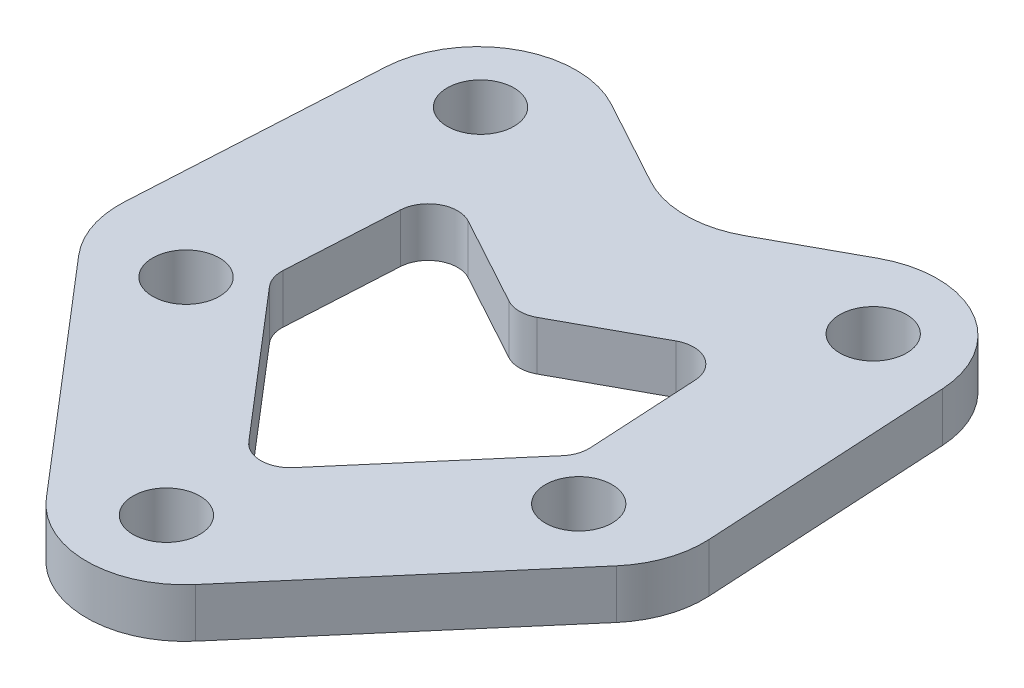
ISO-10303-21;
HEADER;
FILE_DESCRIPTION(('STEP AP214'),'2;1');
FILE_NAME('part.step','',(''),(''),'','','');
FILE_SCHEMA(('AUTOMOTIVE_DESIGN { 1 0 10303 214 1 1 1 1 }'));
ENDSEC;
DATA;
#1=APPLICATION_CONTEXT('core data for automotive mechanical design processes');
#2=APPLICATION_PROTOCOL_DEFINITION('international standard','automotive_design',2000,#1);
#3=PRODUCT_CONTEXT('',#1,'mechanical');
#4=PRODUCT('Part','Part','',(#3));
#5=PRODUCT_RELATED_PRODUCT_CATEGORY('part','',(#4));
#6=PRODUCT_DEFINITION_FORMATION('','',#4);
#7=PRODUCT_DEFINITION_CONTEXT('part definition',#1,'design');
#8=PRODUCT_DEFINITION('design','',#6,#7);
#9=PRODUCT_DEFINITION_SHAPE('','',#8);
#10=(LENGTH_UNIT() NAMED_UNIT(*) SI_UNIT(.MILLI.,.METRE.));
#11=(NAMED_UNIT(*) PLANE_ANGLE_UNIT() SI_UNIT($,.RADIAN.));
#12=(NAMED_UNIT(*) SI_UNIT($,.STERADIAN.) SOLID_ANGLE_UNIT());
#13=UNCERTAINTY_MEASURE_WITH_UNIT(LENGTH_MEASURE(1.E-05),#10,'distance_accuracy_value','');
#14=(GEOMETRIC_REPRESENTATION_CONTEXT(3) GLOBAL_UNCERTAINTY_ASSIGNED_CONTEXT((#13)) GLOBAL_UNIT_ASSIGNED_CONTEXT((#10,
#11,#12)) REPRESENTATION_CONTEXT('',''));
#15=CARTESIAN_POINT('',(0.,0.,0.));
#16=DIRECTION('',(0.,0.,1.));
#17=DIRECTION('',(1.,0.,0.));
#18=AXIS2_PLACEMENT_3D('',#15,#16,#17);
#19=CARTESIAN_POINT('',(-19.05,3.175,-3.175));
#20=DIRECTION('',(0.998460353205412,0.,0.055470019622523));
#21=DIRECTION('',(0.055470019622523,0.,-0.998460353205413));
#22=AXIS2_PLACEMENT_3D('',#19,#20,#21);
#23=PLANE('',#22);
#24=DIRECTION('',(-0.055470019622523,0.,0.998460353205412));
#25=VECTOR('',#24,1.);
#26=CARTESIAN_POINT('',(-19.05,0.,-3.175));
#27=LINE('',#26,#25);
#28=CARTESIAN_POINT('',(-18.0200099535956,0.,-21.7148208352801));
#29=VERTEX_POINT('',#28);
#30=CARTESIAN_POINT('',(-18.9084699795526,0.,-5.72254036805263));
#31=VERTEX_POINT('',#30);
#32=EDGE_CURVE('E244',#29,#31,#27,.T.);
#33=ORIENTED_EDGE('',*,*,#32,.T.);
#34=DIRECTION('',(0.,-1.,0.));
#35=VECTOR('',#34,1.);
#36=CARTESIAN_POINT('',(-18.9084699795526,3.175,-5.72254036805263));
#37=LINE('',#36,#35);
#38=CARTESIAN_POINT('',(-18.9084699795526,3.175,-5.72254036805263));
#39=VERTEX_POINT('',#38);
#40=EDGE_CURVE('E222',#31,#39,#37,.F.);
#41=ORIENTED_EDGE('',*,*,#40,.T.);
#42=DIRECTION('',(-0.055470019622523,0.,0.998460353205412));
#43=VECTOR('',#42,1.);
#44=CARTESIAN_POINT('',(-19.05,3.175,-3.175));
#45=LINE('',#44,#43);
#46=CARTESIAN_POINT('',(-18.0200099535956,3.175,-21.7148208352801));
#47=VERTEX_POINT('',#46);
#48=EDGE_CURVE('E263',#47,#39,#45,.T.);
#49=ORIENTED_EDGE('',*,*,#48,.F.);
#50=DIRECTION('',(0.,-1.,0.));
#51=VECTOR('',#50,1.);
#52=CARTESIAN_POINT('',(-18.0200099535956,3.175,-21.7148208352801));
#53=LINE('',#52,#51);
#54=EDGE_CURVE('E227',#47,#29,#53,.T.);
#55=ORIENTED_EDGE('',*,*,#54,.T.);
#56=EDGE_LOOP('',(#33,#41,#49,#55));
#57=FACE_BOUND('',#56,.T.);
#58=ADVANCED_FACE('F45',(#57),#23,.F.);
#59=CARTESIAN_POINT('',(0.,3.175,19.05));
#60=DIRECTION('',(0.759256602365296,0.,-0.650791373455968));
#61=DIRECTION('',(-0.650791373455969,0.,-0.759256602365297));
#62=AXIS2_PLACEMENT_3D('',#59,#60,#61);
#63=PLANE('',#62);
#64=DIRECTION('',(0.650791373455969,0.,0.759256602365297));
#65=VECTOR('',#64,1.);
#66=CARTESIAN_POINT('',(0.,3.175,19.05));
#67=LINE('',#66,#65);
#68=CARTESIAN_POINT('',(-17.3895261617179,3.175,-1.23778052200422));
#69=VERTEX_POINT('',#68);
#70=CARTESIAN_POINT('',(-4.82127942501963,3.175,13.4251740041438));
#71=VERTEX_POINT('',#70);
#72=EDGE_CURVE('E237',#69,#71,#67,.T.);
#73=ORIENTED_EDGE('',*,*,#72,.F.);
#74=DIRECTION('',(0.,-1.,0.));
#75=VECTOR('',#74,1.);
#76=CARTESIAN_POINT('',(-17.3895261617179,3.175,-1.23778052200422));
#77=LINE('',#76,#75);
#78=CARTESIAN_POINT('',(-17.3895261617179,0.,-1.23778052200422));
#79=VERTEX_POINT('',#78);
#80=EDGE_CURVE('E221',#69,#79,#77,.T.);
#81=ORIENTED_EDGE('',*,*,#80,.T.);
#82=DIRECTION('',(0.650791373455969,0.,0.759256602365297));
#83=VECTOR('',#82,1.);
#84=CARTESIAN_POINT('',(0.,0.,19.05));
#85=LINE('',#84,#83);
#86=CARTESIAN_POINT('',(-4.82127942501963,0.,13.4251740041438));
#87=VERTEX_POINT('',#86);
#88=EDGE_CURVE('E234',#79,#87,#85,.T.);
#89=ORIENTED_EDGE('',*,*,#88,.T.);
#90=DIRECTION('',(0.,-1.,0.));
#91=VECTOR('',#90,1.);
#92=CARTESIAN_POINT('',(-4.82127942501963,3.175,13.4251740041438));
#93=LINE('',#92,#91);
#94=EDGE_CURVE('E239',#87,#71,#93,.F.);
#95=ORIENTED_EDGE('',*,*,#94,.T.);
#96=EDGE_LOOP('',(#73,#81,#89,#95));
#97=FACE_BOUND('',#96,.T.);
#98=ADVANCED_FACE('F233',(#97),#63,.F.);
#99=CARTESIAN_POINT('',(19.05,3.175,-3.175));
#100=DIRECTION('',(-0.759256602365296,0.,-0.650791373455968));
#101=DIRECTION('',(-0.650791373455969,0.,0.759256602365297));
#102=AXIS2_PLACEMENT_3D('',#99,#100,#101);
#103=PLANE('',#102);
#104=DIRECTION('',(0.650791373455969,0.,-0.759256602365297));
#105=VECTOR('',#104,1.);
#106=CARTESIAN_POINT('',(19.05,3.175,-3.175));
#107=LINE('',#106,#105);
#108=CARTESIAN_POINT('',(4.82127942501963,3.175,13.4251740041438));
#109=VERTEX_POINT('',#108);
#110=CARTESIAN_POINT('',(17.3895261617179,3.175,-1.23778052200421));
#111=VERTEX_POINT('',#110);
#112=EDGE_CURVE('E455',#109,#111,#107,.T.);
#113=ORIENTED_EDGE('',*,*,#112,.F.);
#114=DIRECTION('',(0.,-1.,0.));
#115=VECTOR('',#114,1.);
#116=CARTESIAN_POINT('',(4.82127942501963,3.175,13.4251740041438));
#117=LINE('',#116,#115);
#118=CARTESIAN_POINT('',(4.82127942501963,0.,13.4251740041438));
#119=VERTEX_POINT('',#118);
#120=EDGE_CURVE('E290',#109,#119,#117,.T.);
#121=ORIENTED_EDGE('',*,*,#120,.T.);
#122=DIRECTION('',(0.650791373455969,0.,-0.759256602365297));
#123=VECTOR('',#122,1.);
#124=CARTESIAN_POINT('',(19.05,0.,-3.175));
#125=LINE('',#124,#123);
#126=CARTESIAN_POINT('',(17.3895261617179,0.,-1.23778052200421));
#127=VERTEX_POINT('',#126);
#128=EDGE_CURVE('E243',#119,#127,#125,.T.);
#129=ORIENTED_EDGE('',*,*,#128,.T.);
#130=DIRECTION('',(0.,-1.,0.));
#131=VECTOR('',#130,1.);
#132=CARTESIAN_POINT('',(17.3895261617179,3.175,-1.23778052200421));
#133=LINE('',#132,#131);
#134=EDGE_CURVE('E287',#127,#111,#133,.F.);
#135=ORIENTED_EDGE('',*,*,#134,.T.);
#136=EDGE_LOOP('',(#113,#121,#129,#135));
#137=FACE_BOUND('',#136,.T.);
#138=ADVANCED_FACE('F503',(#137),#103,.F.);
#139=CARTESIAN_POINT('',(17.4625,3.175,-31.75));
#140=DIRECTION('',(-0.998460353205412,0.,0.055470019622523));
#141=DIRECTION('',(0.055470019622523,0.,0.998460353205413));
#142=AXIS2_PLACEMENT_3D('',#139,#140,#141);
#143=PLANE('',#142);
#144=DIRECTION('',(-0.055470019622523,0.,-0.998460353205412));
#145=VECTOR('',#144,1.);
#146=CARTESIAN_POINT('',(17.4625,3.175,-31.75));
#147=LINE('',#146,#145);
#148=CARTESIAN_POINT('',(18.9084699795526,3.175,-5.72254036805263));
#149=VERTEX_POINT('',#148);
#150=CARTESIAN_POINT('',(18.0200099535956,3.175,-21.7148208352801));
#151=VERTEX_POINT('',#150);
#152=EDGE_CURVE('E459',#149,#151,#147,.T.);
#153=ORIENTED_EDGE('',*,*,#152,.F.);
#154=DIRECTION('',(0.,-1.,0.));
#155=VECTOR('',#154,1.);
#156=CARTESIAN_POINT('',(18.9084699795526,3.175,-5.72254036805264));
#157=LINE('',#156,#155);
#158=CARTESIAN_POINT('',(18.9084699795526,0.,-5.72254036805263));
#159=VERTEX_POINT('',#158);
#160=EDGE_CURVE('E295',#149,#159,#157,.T.);
#161=ORIENTED_EDGE('',*,*,#160,.T.);
#162=DIRECTION('',(-0.055470019622523,0.,-0.998460353205412));
#163=VECTOR('',#162,1.);
#164=CARTESIAN_POINT('',(17.4625,0.,-31.75));
#165=LINE('',#164,#163);
#166=CARTESIAN_POINT('',(18.0200099535956,0.,-21.7148208352801));
#167=VERTEX_POINT('',#166);
#168=EDGE_CURVE('E248',#159,#167,#165,.T.);
#169=ORIENTED_EDGE('',*,*,#168,.T.);
#170=DIRECTION('',(0.,-1.,0.));
#171=VECTOR('',#170,1.);
#172=CARTESIAN_POINT('',(18.0200099535956,3.175,-21.7148208352801));
#173=LINE('',#172,#171);
#174=EDGE_CURVE('E293',#167,#151,#173,.F.);
#175=ORIENTED_EDGE('',*,*,#174,.T.);
#176=EDGE_LOOP('',(#153,#161,#169,#175));
#177=FACE_BOUND('',#176,.T.);
#178=ADVANCED_FACE('F495',(#177),#143,.F.);
#179=CARTESIAN_POINT('',(0.,3.175,-22.225));
#180=DIRECTION('',(0.478852130680573,0.,0.877895572914384));
#181=DIRECTION('',(0.877895572914384,0.,-0.478852130680573));
#182=AXIS2_PLACEMENT_3D('',#179,#180,#181);
#183=PLANE('',#182);
#184=DIRECTION('',(-0.877895572914384,0.,0.478852130680573));
#185=VECTOR('',#184,1.);
#186=CARTESIAN_POINT('',(0.,3.175,-22.225));
#187=LINE('',#186,#185);
#188=CARTESIAN_POINT('',(8.63907568091955,3.175,-26.9372230986834));
#189=VERTEX_POINT('',#188);
#190=CARTESIAN_POINT('',(3.04071102982164,3.175,-23.88356965263));
#191=VERTEX_POINT('',#190);
#192=EDGE_CURVE('E463',#189,#191,#187,.T.);
#193=ORIENTED_EDGE('',*,*,#192,.F.);
#194=DIRECTION('',(0.,-1.,0.));
#195=VECTOR('',#194,1.);
#196=CARTESIAN_POINT('',(8.63907568091954,3.175,-26.9372230986834));
#197=LINE('',#196,#195);
#198=CARTESIAN_POINT('',(8.63907568091955,0.,-26.9372230986834));
#199=VERTEX_POINT('',#198);
#200=EDGE_CURVE('E301',#189,#199,#197,.T.);
#201=ORIENTED_EDGE('',*,*,#200,.T.);
#202=DIRECTION('',(-0.877895572914384,0.,0.478852130680573));
#203=VECTOR('',#202,1.);
#204=CARTESIAN_POINT('',(0.,0.,-22.225));
#205=LINE('',#204,#203);
#206=CARTESIAN_POINT('',(3.04071102982164,0.,-23.88356965263));
#207=VERTEX_POINT('',#206);
#208=EDGE_CURVE('E257',#199,#207,#205,.T.);
#209=ORIENTED_EDGE('',*,*,#208,.T.);
#210=DIRECTION('',(0.,-1.,0.));
#211=VECTOR('',#210,1.);
#212=CARTESIAN_POINT('',(3.04071102982164,3.175,-23.88356965263));
#213=LINE('',#212,#211);
#214=EDGE_CURVE('E299',#207,#191,#213,.F.);
#215=ORIENTED_EDGE('',*,*,#214,.T.);
#216=EDGE_LOOP('',(#193,#201,#209,#215));
#217=FACE_BOUND('',#216,.T.);
#218=ADVANCED_FACE('F486',(#217),#183,.F.);
#219=CARTESIAN_POINT('',(-17.4625,3.175,-31.75));
#220=DIRECTION('',(-0.478852130680573,0.,0.877895572914384));
#221=DIRECTION('',(0.877895572914384,0.,0.478852130680573));
#222=AXIS2_PLACEMENT_3D('',#219,#220,#221);
#223=PLANE('',#222);
#224=DIRECTION('',(-0.877895572914385,0.,-0.478852130680573));
#225=VECTOR('',#224,1.);
#226=CARTESIAN_POINT('',(-17.4625,0.,-31.75));
#227=LINE('',#226,#225);
#228=CARTESIAN_POINT('',(-3.04071102982163,0.,-23.88356965263));
#229=VERTEX_POINT('',#228);
#230=CARTESIAN_POINT('',(-8.63907568091954,0.,-26.9372230986834));
#231=VERTEX_POINT('',#230);
#232=EDGE_CURVE('E260',#229,#231,#227,.T.);
#233=ORIENTED_EDGE('',*,*,#232,.T.);
#234=DIRECTION('',(0.,-1.,0.));
#235=VECTOR('',#234,1.);
#236=CARTESIAN_POINT('',(-8.63907568091954,3.175,-26.9372230986834));
#237=LINE('',#236,#235);
#238=CARTESIAN_POINT('',(-8.63907568091954,3.175,-26.9372230986834));
#239=VERTEX_POINT('',#238);
#240=EDGE_CURVE('E307',#231,#239,#237,.F.);
#241=ORIENTED_EDGE('',*,*,#240,.T.);
#242=DIRECTION('',(-0.877895572914385,0.,-0.478852130680573));
#243=VECTOR('',#242,1.);
#244=CARTESIAN_POINT('',(-17.4625,3.175,-31.75));
#245=LINE('',#244,#243);
#246=CARTESIAN_POINT('',(-3.04071102982163,3.175,-23.88356965263));
#247=VERTEX_POINT('',#246);
#248=EDGE_CURVE('E264',#247,#239,#245,.T.);
#249=ORIENTED_EDGE('',*,*,#248,.F.);
#250=DIRECTION('',(0.,-1.,0.));
#251=VECTOR('',#250,1.);
#252=CARTESIAN_POINT('',(-3.04071102982164,0.,-23.88356965263));
#253=LINE('',#252,#251);
#254=EDGE_CURVE('E304',#247,#229,#253,.T.);
#255=ORIENTED_EDGE('',*,*,#254,.T.);
#256=EDGE_LOOP('',(#233,#241,#249,#255));
#257=FACE_BOUND('',#256,.T.);
#258=ADVANCED_FACE('F479',(#257),#223,.F.);
#259=CARTESIAN_POINT('',(0.,3.175,0.));
#260=DIRECTION('',(0.,-1.,0.));
#261=DIRECTION('',(0.,0.,-1.));
#262=AXIS2_PLACEMENT_3D('',#259,#260,#261);
#263=PLANE('',#262);
#264=DIRECTION('',(-0.877895572914384,0.,-0.478852130680573));
#265=VECTOR('',#264,1.);
#266=CARTESIAN_POINT('',(0.,3.175,-12.0985108431091));
#267=LINE('',#266,#265);
#268=CARTESIAN_POINT('',(-0.912213308946494,3.175,-12.5960817388981));
#269=VERTEX_POINT('',#268);
#270=CARTESIAN_POINT('',(-6.71967409931352,3.175,-15.7637876245529));
#271=VERTEX_POINT('',#270);
#272=EDGE_CURVE('E409',#269,#271,#267,.T.);
#273=ORIENTED_EDGE('',*,*,#272,.F.);
#274=CARTESIAN_POINT('',(0.,3.175,-14.2684728053));
#275=DIRECTION('',(0.,-1.,0.));
#276=DIRECTION('',(0.,0.,-1.));
#277=AXIS2_PLACEMENT_3D('',#274,#275,#276);
#278=CIRCLE('',#277,1.905);
#279=CARTESIAN_POINT('',(0.91221330894649,3.175,-12.5960817388981));
#280=VERTEX_POINT('',#279);
#281=EDGE_CURVE('E328',#269,#280,#278,.F.);
#282=ORIENTED_EDGE('',*,*,#281,.T.);
#283=DIRECTION('',(-0.877895572914384,0.,0.478852130680573));
#284=VECTOR('',#283,1.);
#285=CARTESIAN_POINT('',(9.36670139503766,3.175,-17.2076206949479));
#286=LINE('',#285,#284);
#287=CARTESIAN_POINT('',(6.71967409931352,3.175,-15.7637876245529));
#288=VERTEX_POINT('',#287);
#289=EDGE_CURVE('E419',#288,#280,#286,.T.);
#290=ORIENTED_EDGE('',*,*,#289,.F.);
#291=CARTESIAN_POINT('',(7.63188740826001,3.175,-14.091396558151));
#292=DIRECTION('',(0.,-1.,0.));
#293=DIRECTION('',(0.,0.,-1.));
#294=AXIS2_PLACEMENT_3D('',#291,#292,#293);
#295=CIRCLE('',#294,1.905);
#296=CARTESIAN_POINT('',(9.53395438111633,3.175,-14.1970669455319));
#297=VERTEX_POINT('',#296);
#298=EDGE_CURVE('E357',#288,#297,#295,.T.);
#299=ORIENTED_EDGE('',*,*,#298,.T.);
#300=DIRECTION('',(-0.055470019622523,0.,-0.998460353205412));
#301=VECTOR('',#300,1.);
#302=CARTESIAN_POINT('',(9.97554543137757,3.175,-6.24842804082946));
#303=LINE('',#302,#301);
#304=CARTESIAN_POINT('',(9.93308642524336,3.175,-7.01269015124525));
#305=VERTEX_POINT('',#304);
#306=EDGE_CURVE('E416',#305,#297,#303,.T.);
#307=ORIENTED_EDGE('',*,*,#306,.F.);
#308=CARTESIAN_POINT('',(8.03101945238705,3.175,-6.90701976386434));
#309=DIRECTION('',(0.,-1.,0.));
#310=DIRECTION('',(0.,0.,-1.));
#311=AXIS2_PLACEMENT_3D('',#308,#309,#310);
#312=CIRCLE('',#311,1.905);
#313=CARTESIAN_POINT('',(9.47740327989294,3.175,-5.66726219743072));
#314=VERTEX_POINT('',#313);
#315=EDGE_CURVE('E363',#305,#314,#312,.T.);
#316=ORIENTED_EDGE('',*,*,#315,.T.);
#317=DIRECTION('',(0.650791373455968,0.,-0.759256602365297));
#318=VECTOR('',#317,1.);
#319=CARTESIAN_POINT('',(0.,3.175,5.38970829577771));
#320=LINE('',#319,#318);
#321=CARTESIAN_POINT('',(1.44638382750589,3.175,3.70226049702084));
#322=VERTEX_POINT('',#321);
#323=EDGE_CURVE('E376',#322,#314,#320,.T.);
#324=ORIENTED_EDGE('',*,*,#323,.F.);
#325=CARTESIAN_POINT('',(0.,3.175,2.46250293058722));
#326=DIRECTION('',(0.,-1.,0.));
#327=DIRECTION('',(0.,0.,-1.));
#328=AXIS2_PLACEMENT_3D('',#325,#326,#327);
#329=CIRCLE('',#328,1.905);
#330=CARTESIAN_POINT('',(-1.44638382750589,3.175,3.70226049702084));
#331=VERTEX_POINT('',#330);
#332=EDGE_CURVE('E53',#322,#331,#329,.T.);
#333=ORIENTED_EDGE('',*,*,#332,.T.);
#334=DIRECTION('',(0.650791373455968,0.,0.759256602365297));
#335=VECTOR('',#334,1.);
#336=CARTESIAN_POINT('',(-9.97554543137757,3.175,-6.24842804082946));
#337=LINE('',#336,#335);
#338=CARTESIAN_POINT('',(-9.47740327989294,3.175,-5.66726219743072));
#339=VERTEX_POINT('',#338);
#340=EDGE_CURVE('E374',#339,#331,#337,.T.);
#341=ORIENTED_EDGE('',*,*,#340,.F.);
#342=CARTESIAN_POINT('',(-8.03101945238705,3.175,-6.90701976386434));
#343=DIRECTION('',(0.,-1.,0.));
#344=DIRECTION('',(0.,0.,-1.));
#345=AXIS2_PLACEMENT_3D('',#342,#343,#344);
#346=CIRCLE('',#345,1.905);
#347=CARTESIAN_POINT('',(-9.93308642524336,3.175,-7.01269015124524));
#348=VERTEX_POINT('',#347);
#349=EDGE_CURVE('E349',#339,#348,#346,.T.);
#350=ORIENTED_EDGE('',*,*,#349,.T.);
#351=DIRECTION('',(-0.055470019622523,0.,0.998460353205412));
#352=VECTOR('',#351,1.);
#353=CARTESIAN_POINT('',(-9.36670139503766,3.175,-17.2076206949479));
#354=LINE('',#353,#352);
#355=CARTESIAN_POINT('',(-9.53395438111632,3.175,-14.1970669455319));
#356=VERTEX_POINT('',#355);
#357=EDGE_CURVE('E385',#356,#348,#354,.T.);
#358=ORIENTED_EDGE('',*,*,#357,.F.);
#359=CARTESIAN_POINT('',(-7.63188740826001,3.175,-14.091396558151));
#360=DIRECTION('',(0.,-1.,0.));
#361=DIRECTION('',(0.,0.,-1.));
#362=AXIS2_PLACEMENT_3D('',#359,#360,#361);
#363=CIRCLE('',#362,1.905);
#364=EDGE_CURVE('E353',#356,#271,#363,.T.);
#365=ORIENTED_EDGE('',*,*,#364,.T.);
#366=EDGE_LOOP('',(#273,#282,#290,#299,#307,#316,#324,#333,#341,#350,#358,#365));
#367=FACE_BOUND('',#366,.T.);
#368=CARTESIAN_POINT('',(0.,3.175,10.4775));
#369=DIRECTION('',(0.,1.,0.));
#370=DIRECTION('',(0.,0.,1.));
#371=AXIS2_PLACEMENT_3D('',#368,#369,#370);
#372=CIRCLE('',#371,2.159);
#373=CARTESIAN_POINT('',(0.,3.175,12.6365));
#374=VERTEX_POINT('',#373);
#375=EDGE_CURVE('E425',#374,#374,#372,.T.);
#376=ORIENTED_EDGE('',*,*,#375,.F.);
#377=EDGE_LOOP('',(#376));
#378=FACE_BOUND('',#377,.T.);
#379=CARTESIAN_POINT('',(12.7,3.175,-3.4925));
#380=DIRECTION('',(0.,1.,0.));
#381=DIRECTION('',(0.,0.,1.));
#382=AXIS2_PLACEMENT_3D('',#379,#380,#381);
#383=CIRCLE('',#382,2.159);
#384=CARTESIAN_POINT('',(12.7,3.175,-1.3335));
#385=VERTEX_POINT('',#384);
#386=EDGE_CURVE('E428',#385,#385,#383,.T.);
#387=ORIENTED_EDGE('',*,*,#386,.F.);
#388=EDGE_LOOP('',(#387));
#389=FACE_BOUND('',#388,.T.);
#390=CARTESIAN_POINT('',(-12.7,3.175,-3.4925));
#391=DIRECTION('',(0.,1.,0.));
#392=DIRECTION('',(0.,0.,1.));
#393=AXIS2_PLACEMENT_3D('',#390,#391,#392);
#394=CIRCLE('',#393,2.159);
#395=CARTESIAN_POINT('',(-12.7,3.175,-1.3335));
#396=VERTEX_POINT('',#395);
#397=EDGE_CURVE('E435',#396,#396,#394,.T.);
#398=ORIENTED_EDGE('',*,*,#397,.F.);
#399=EDGE_LOOP('',(#398));
#400=FACE_BOUND('',#399,.T.);
#401=CARTESIAN_POINT('',(-12.7,3.175,-22.5425));
#402=DIRECTION('',(0.,1.,0.));
#403=DIRECTION('',(0.,0.,1.));
#404=AXIS2_PLACEMENT_3D('',#401,#402,#403);
#405=CIRCLE('',#404,2.159);
#406=CARTESIAN_POINT('',(-12.7,3.175,-20.3835));
#407=VERTEX_POINT('',#406);
#408=EDGE_CURVE('E441',#407,#407,#405,.T.);
#409=ORIENTED_EDGE('',*,*,#408,.F.);
#410=EDGE_LOOP('',(#409));
#411=FACE_BOUND('',#410,.T.);
#412=CARTESIAN_POINT('',(12.7,3.175,-22.5425));
#413=DIRECTION('',(0.,1.,0.));
#414=DIRECTION('',(0.,0.,1.));
#415=AXIS2_PLACEMENT_3D('',#412,#413,#414);
#416=CIRCLE('',#415,2.159);
#417=CARTESIAN_POINT('',(12.7,3.175,-20.3835));
#418=VERTEX_POINT('',#417);
#419=EDGE_CURVE('E447',#418,#418,#416,.T.);
#420=ORIENTED_EDGE('',*,*,#419,.F.);
#421=EDGE_LOOP('',(#420));
#422=FACE_BOUND('',#421,.T.);
#423=ORIENTED_EDGE('',*,*,#48,.T.);
#424=CARTESIAN_POINT('',(-12.5682467366983,3.175,-5.37030574344961));
#425=DIRECTION('',(0.,-1.,0.));
#426=DIRECTION('',(0.,0.,-1.));
#427=AXIS2_PLACEMENT_3D('',#424,#425,#426);
#428=CIRCLE('',#427,6.35);
#429=EDGE_CURVE('E285',#39,#69,#428,.F.);
#430=ORIENTED_EDGE('',*,*,#429,.T.);
#431=ORIENTED_EDGE('',*,*,#72,.T.);
#432=CARTESIAN_POINT('',(0.,3.175,9.29264878269836));
#433=DIRECTION('',(0.,-1.,0.));
#434=DIRECTION('',(0.,0.,-1.));
#435=AXIS2_PLACEMENT_3D('',#432,#433,#434);
#436=CIRCLE('',#435,6.35);
#437=EDGE_CURVE('E283',#71,#109,#436,.F.);
#438=ORIENTED_EDGE('',*,*,#437,.T.);
#439=ORIENTED_EDGE('',*,*,#112,.T.);
#440=CARTESIAN_POINT('',(12.5682467366983,3.175,-5.37030574344962));
#441=DIRECTION('',(0.,-1.,0.));
#442=DIRECTION('',(0.,0.,-1.));
#443=AXIS2_PLACEMENT_3D('',#440,#441,#442);
#444=CIRCLE('',#443,6.35);
#445=EDGE_CURVE('E280',#111,#149,#444,.F.);
#446=ORIENTED_EDGE('',*,*,#445,.T.);
#447=ORIENTED_EDGE('',*,*,#152,.T.);
#448=CARTESIAN_POINT('',(11.6797867107412,3.175,-21.362586210677));
#449=DIRECTION('',(0.,-1.,0.));
#450=DIRECTION('',(0.,0.,-1.));
#451=AXIS2_PLACEMENT_3D('',#448,#449,#450);
#452=CIRCLE('',#451,6.35);
#453=EDGE_CURVE('E278',#151,#189,#452,.F.);
#454=ORIENTED_EDGE('',*,*,#453,.T.);
#455=ORIENTED_EDGE('',*,*,#192,.T.);
#456=CARTESIAN_POINT('',(0.,3.175,-29.4582065406363));
#457=DIRECTION('',(0.,-1.,0.));
#458=DIRECTION('',(0.,0.,-1.));
#459=AXIS2_PLACEMENT_3D('',#456,#457,#458);
#460=CIRCLE('',#459,6.35);
#461=EDGE_CURVE('E311',#191,#247,#460,.T.);
#462=ORIENTED_EDGE('',*,*,#461,.T.);
#463=ORIENTED_EDGE('',*,*,#248,.T.);
#464=CARTESIAN_POINT('',(-11.6797867107412,3.175,-21.362586210677));
#465=DIRECTION('',(0.,-1.,0.));
#466=DIRECTION('',(0.,0.,-1.));
#467=AXIS2_PLACEMENT_3D('',#464,#465,#466);
#468=CIRCLE('',#467,6.35);
#469=EDGE_CURVE('E276',#239,#47,#468,.F.);
#470=ORIENTED_EDGE('',*,*,#469,.T.);
#471=EDGE_LOOP('',(#423,#430,#431,#438,#439,#446,#447,#454,#455,#462,#463,#470));
#472=FACE_BOUND('',#471,.T.);
#473=ADVANCED_FACE('F372',(#367,#378,#389,#400,#411,#422,#472),#263,.F.);
#474=CARTESIAN_POINT('',(0.,0.,0.));
#475=DIRECTION('',(0.,-1.,0.));
#476=DIRECTION('',(0.,0.,-1.));
#477=AXIS2_PLACEMENT_3D('',#474,#475,#476);
#478=PLANE('',#477);
#479=DIRECTION('',(-0.877895572914384,0.,0.478852130680573));
#480=VECTOR('',#479,1.);
#481=CARTESIAN_POINT('',(9.36670139503766,0.,-17.2076206949479));
#482=LINE('',#481,#480);
#483=CARTESIAN_POINT('',(6.71967409931352,0.,-15.7637876245529));
#484=VERTEX_POINT('',#483);
#485=CARTESIAN_POINT('',(0.91221330894649,0.,-12.5960817388981));
#486=VERTEX_POINT('',#485);
#487=EDGE_CURVE('E401',#484,#486,#482,.T.);
#488=ORIENTED_EDGE('',*,*,#487,.T.);
#489=CARTESIAN_POINT('',(0.,0.,-14.2684728053));
#490=DIRECTION('',(0.,-1.,0.));
#491=DIRECTION('',(0.,0.,-1.));
#492=AXIS2_PLACEMENT_3D('',#489,#490,#491);
#493=CIRCLE('',#492,1.905);
#494=CARTESIAN_POINT('',(-0.912213308946494,0.,-12.5960817388981));
#495=VERTEX_POINT('',#494);
#496=EDGE_CURVE('E335',#486,#495,#493,.T.);
#497=ORIENTED_EDGE('',*,*,#496,.T.);
#498=DIRECTION('',(-0.877895572914384,0.,-0.478852130680573));
#499=VECTOR('',#498,1.);
#500=CARTESIAN_POINT('',(0.,0.,-12.0985108431091));
#501=LINE('',#500,#499);
#502=CARTESIAN_POINT('',(-6.71967409931352,0.,-15.7637876245529));
#503=VERTEX_POINT('',#502);
#504=EDGE_CURVE('E422',#495,#503,#501,.T.);
#505=ORIENTED_EDGE('',*,*,#504,.T.);
#506=CARTESIAN_POINT('',(-7.63188740826001,0.,-14.091396558151));
#507=DIRECTION('',(0.,-1.,0.));
#508=DIRECTION('',(0.,0.,-1.));
#509=AXIS2_PLACEMENT_3D('',#506,#507,#508);
#510=CIRCLE('',#509,1.905);
#511=CARTESIAN_POINT('',(-9.53395438111632,0.,-14.1970669455319));
#512=VERTEX_POINT('',#511);
#513=EDGE_CURVE('E355',#503,#512,#510,.F.);
#514=ORIENTED_EDGE('',*,*,#513,.T.);
#515=DIRECTION('',(-0.055470019622523,0.,0.998460353205412));
#516=VECTOR('',#515,1.);
#517=CARTESIAN_POINT('',(-9.36670139503766,0.,-17.2076206949479));
#518=LINE('',#517,#516);
#519=CARTESIAN_POINT('',(-9.93308642524336,0.,-7.01269015124524));
#520=VERTEX_POINT('',#519);
#521=EDGE_CURVE('E403',#512,#520,#518,.T.);
#522=ORIENTED_EDGE('',*,*,#521,.T.);
#523=CARTESIAN_POINT('',(-8.03101945238705,0.,-6.90701976386434));
#524=DIRECTION('',(0.,-1.,0.));
#525=DIRECTION('',(0.,0.,-1.));
#526=AXIS2_PLACEMENT_3D('',#523,#524,#525);
#527=CIRCLE('',#526,1.905);
#528=CARTESIAN_POINT('',(-9.47740327989294,0.,-5.66726219743072));
#529=VERTEX_POINT('',#528);
#530=EDGE_CURVE('E351',#520,#529,#527,.F.);
#531=ORIENTED_EDGE('',*,*,#530,.T.);
#532=DIRECTION('',(0.650791373455968,0.,0.759256602365297));
#533=VECTOR('',#532,1.);
#534=CARTESIAN_POINT('',(-9.97554543137757,0.,-6.24842804082946));
#535=LINE('',#534,#533);
#536=CARTESIAN_POINT('',(-1.44638382750589,0.,3.70226049702084));
#537=VERTEX_POINT('',#536);
#538=EDGE_CURVE('E392',#529,#537,#535,.T.);
#539=ORIENTED_EDGE('',*,*,#538,.T.);
#540=CARTESIAN_POINT('',(0.,0.,2.46250293058722));
#541=DIRECTION('',(0.,-1.,0.));
#542=DIRECTION('',(0.,0.,-1.));
#543=AXIS2_PLACEMENT_3D('',#540,#541,#542);
#544=CIRCLE('',#543,1.905);
#545=CARTESIAN_POINT('',(1.44638382750589,0.,3.70226049702084));
#546=VERTEX_POINT('',#545);
#547=EDGE_CURVE('E11',#537,#546,#544,.F.);
#548=ORIENTED_EDGE('',*,*,#547,.T.);
#549=DIRECTION('',(0.650791373455968,0.,-0.759256602365297));
#550=VECTOR('',#549,1.);
#551=CARTESIAN_POINT('',(0.,0.,5.38970829577771));
#552=LINE('',#551,#550);
#553=CARTESIAN_POINT('',(9.47740327989294,0.,-5.66726219743072));
#554=VERTEX_POINT('',#553);
#555=EDGE_CURVE('E391',#546,#554,#552,.T.);
#556=ORIENTED_EDGE('',*,*,#555,.T.);
#557=CARTESIAN_POINT('',(8.03101945238705,0.,-6.90701976386434));
#558=DIRECTION('',(0.,-1.,0.));
#559=DIRECTION('',(0.,0.,-1.));
#560=AXIS2_PLACEMENT_3D('',#557,#558,#559);
#561=CIRCLE('',#560,1.905);
#562=CARTESIAN_POINT('',(9.93308642524336,0.,-7.01269015124525));
#563=VERTEX_POINT('',#562);
#564=EDGE_CURVE('E72',#554,#563,#561,.F.);
#565=ORIENTED_EDGE('',*,*,#564,.T.);
#566=DIRECTION('',(-0.055470019622523,0.,-0.998460353205412));
#567=VECTOR('',#566,1.);
#568=CARTESIAN_POINT('',(9.97554543137757,0.,-6.24842804082946));
#569=LINE('',#568,#567);
#570=CARTESIAN_POINT('',(9.53395438111633,0.,-14.1970669455319));
#571=VERTEX_POINT('',#570);
#572=EDGE_CURVE('E397',#563,#571,#569,.T.);
#573=ORIENTED_EDGE('',*,*,#572,.T.);
#574=CARTESIAN_POINT('',(7.63188740826001,0.,-14.091396558151));
#575=DIRECTION('',(0.,-1.,0.));
#576=DIRECTION('',(0.,0.,-1.));
#577=AXIS2_PLACEMENT_3D('',#574,#575,#576);
#578=CIRCLE('',#577,1.905);
#579=EDGE_CURVE('E360',#571,#484,#578,.F.);
#580=ORIENTED_EDGE('',*,*,#579,.T.);
#581=EDGE_LOOP('',(#488,#497,#505,#514,#522,#531,#539,#548,#556,#565,#573,#580));
#582=FACE_BOUND('',#581,.T.);
#583=CARTESIAN_POINT('',(0.,0.,10.4775));
#584=DIRECTION('',(0.,1.,0.));
#585=DIRECTION('',(0.,0.,1.));
#586=AXIS2_PLACEMENT_3D('',#583,#584,#585);
#587=CIRCLE('',#586,2.159);
#588=CARTESIAN_POINT('',(0.,0.,12.6365));
#589=VERTEX_POINT('',#588);
#590=EDGE_CURVE('E250',#589,#589,#587,.T.);
#591=ORIENTED_EDGE('',*,*,#590,.T.);
#592=EDGE_LOOP('',(#591));
#593=FACE_BOUND('',#592,.T.);
#594=CARTESIAN_POINT('',(12.7,0.,-3.4925));
#595=DIRECTION('',(0.,1.,0.));
#596=DIRECTION('',(0.,0.,1.));
#597=AXIS2_PLACEMENT_3D('',#594,#595,#596);
#598=CIRCLE('',#597,2.159);
#599=CARTESIAN_POINT('',(12.7,0.,-1.3335));
#600=VERTEX_POINT('',#599);
#601=EDGE_CURVE('E432',#600,#600,#598,.T.);
#602=ORIENTED_EDGE('',*,*,#601,.T.);
#603=EDGE_LOOP('',(#602));
#604=FACE_BOUND('',#603,.T.);
#605=CARTESIAN_POINT('',(-12.7,0.,-3.4925));
#606=DIRECTION('',(0.,1.,0.));
#607=DIRECTION('',(0.,0.,1.));
#608=AXIS2_PLACEMENT_3D('',#605,#606,#607);
#609=CIRCLE('',#608,2.159);
#610=CARTESIAN_POINT('',(-12.7,0.,-1.3335));
#611=VERTEX_POINT('',#610);
#612=EDGE_CURVE('E438',#611,#611,#609,.T.);
#613=ORIENTED_EDGE('',*,*,#612,.T.);
#614=EDGE_LOOP('',(#613));
#615=FACE_BOUND('',#614,.T.);
#616=CARTESIAN_POINT('',(-12.7,0.,-22.5425));
#617=DIRECTION('',(0.,1.,0.));
#618=DIRECTION('',(0.,0.,1.));
#619=AXIS2_PLACEMENT_3D('',#616,#617,#618);
#620=CIRCLE('',#619,2.159);
#621=CARTESIAN_POINT('',(-12.7,0.,-20.3835));
#622=VERTEX_POINT('',#621);
#623=EDGE_CURVE('E444',#622,#622,#620,.T.);
#624=ORIENTED_EDGE('',*,*,#623,.T.);
#625=EDGE_LOOP('',(#624));
#626=FACE_BOUND('',#625,.T.);
#627=CARTESIAN_POINT('',(12.7,0.,-22.5425));
#628=DIRECTION('',(0.,1.,0.));
#629=DIRECTION('',(0.,0.,1.));
#630=AXIS2_PLACEMENT_3D('',#627,#628,#629);
#631=CIRCLE('',#630,2.159);
#632=CARTESIAN_POINT('',(12.7,0.,-20.3835));
#633=VERTEX_POINT('',#632);
#634=EDGE_CURVE('E408',#633,#633,#631,.T.);
#635=ORIENTED_EDGE('',*,*,#634,.T.);
#636=EDGE_LOOP('',(#635));
#637=FACE_BOUND('',#636,.T.);
#638=ORIENTED_EDGE('',*,*,#88,.F.);
#639=CARTESIAN_POINT('',(-12.5682467366983,0.,-5.37030574344961));
#640=DIRECTION('',(0.,-1.,0.));
#641=DIRECTION('',(0.,0.,-1.));
#642=AXIS2_PLACEMENT_3D('',#639,#640,#641);
#643=CIRCLE('',#642,6.35);
#644=EDGE_CURVE('E217',#79,#31,#643,.T.);
#645=ORIENTED_EDGE('',*,*,#644,.T.);
#646=ORIENTED_EDGE('',*,*,#32,.F.);
#647=CARTESIAN_POINT('',(-11.6797867107412,0.,-21.362586210677));
#648=DIRECTION('',(0.,-1.,0.));
#649=DIRECTION('',(0.,0.,-1.));
#650=AXIS2_PLACEMENT_3D('',#647,#648,#649);
#651=CIRCLE('',#650,6.35);
#652=EDGE_CURVE('E238',#29,#231,#651,.T.);
#653=ORIENTED_EDGE('',*,*,#652,.T.);
#654=ORIENTED_EDGE('',*,*,#232,.F.);
#655=CARTESIAN_POINT('',(0.,0.,-29.4582065406363));
#656=DIRECTION('',(0.,-1.,0.));
#657=DIRECTION('',(0.,0.,-1.));
#658=AXIS2_PLACEMENT_3D('',#655,#656,#657);
#659=CIRCLE('',#658,6.35);
#660=EDGE_CURVE('E309',#229,#207,#659,.F.);
#661=ORIENTED_EDGE('',*,*,#660,.T.);
#662=ORIENTED_EDGE('',*,*,#208,.F.);
#663=CARTESIAN_POINT('',(11.6797867107412,0.,-21.362586210677));
#664=DIRECTION('',(0.,-1.,0.));
#665=DIRECTION('',(0.,0.,-1.));
#666=AXIS2_PLACEMENT_3D('',#663,#664,#665);
#667=CIRCLE('',#666,6.35);
#668=EDGE_CURVE('E267',#199,#167,#667,.T.);
#669=ORIENTED_EDGE('',*,*,#668,.T.);
#670=ORIENTED_EDGE('',*,*,#168,.F.);
#671=CARTESIAN_POINT('',(12.5682467366983,0.,-5.37030574344962));
#672=DIRECTION('',(0.,-1.,0.));
#673=DIRECTION('',(0.,0.,-1.));
#674=AXIS2_PLACEMENT_3D('',#671,#672,#673);
#675=CIRCLE('',#674,6.35);
#676=EDGE_CURVE('E269',#159,#127,#675,.T.);
#677=ORIENTED_EDGE('',*,*,#676,.T.);
#678=ORIENTED_EDGE('',*,*,#128,.F.);
#679=CARTESIAN_POINT('',(0.,0.,9.29264878269836));
#680=DIRECTION('',(0.,-1.,0.));
#681=DIRECTION('',(0.,0.,-1.));
#682=AXIS2_PLACEMENT_3D('',#679,#680,#681);
#683=CIRCLE('',#682,6.35);
#684=EDGE_CURVE('E228',#119,#87,#683,.T.);
#685=ORIENTED_EDGE('',*,*,#684,.T.);
#686=EDGE_LOOP('',(#638,#645,#646,#653,#654,#661,#662,#669,#670,#677,#678,#685));
#687=FACE_BOUND('',#686,.T.);
#688=ADVANCED_FACE('F241',(#582,#593,#604,#615,#626,#637,#687),#478,.T.);
#689=CARTESIAN_POINT('',(12.7,0.,-22.5425));
#690=DIRECTION('',(0.,1.,0.));
#691=DIRECTION('',(0.,0.,1.));
#692=AXIS2_PLACEMENT_3D('',#689,#690,#691);
#693=CYLINDRICAL_SURFACE('',#692,2.159);
#694=ORIENTED_EDGE('',*,*,#634,.F.);
#695=EDGE_LOOP('',(#694));
#696=FACE_BOUND('',#695,.T.);
#697=ORIENTED_EDGE('',*,*,#419,.T.);
#698=EDGE_LOOP('',(#697));
#699=FACE_BOUND('',#698,.T.);
#700=ADVANCED_FACE('F535',(#696,#699),#693,.F.);
#701=CARTESIAN_POINT('',(-12.7,0.,-22.5425));
#702=DIRECTION('',(0.,1.,0.));
#703=DIRECTION('',(0.,0.,1.));
#704=AXIS2_PLACEMENT_3D('',#701,#702,#703);
#705=CYLINDRICAL_SURFACE('',#704,2.159);
#706=ORIENTED_EDGE('',*,*,#623,.F.);
#707=EDGE_LOOP('',(#706));
#708=FACE_BOUND('',#707,.T.);
#709=ORIENTED_EDGE('',*,*,#408,.T.);
#710=EDGE_LOOP('',(#709));
#711=FACE_BOUND('',#710,.T.);
#712=ADVANCED_FACE('F540',(#708,#711),#705,.F.);
#713=CARTESIAN_POINT('',(-12.7,0.,-3.4925));
#714=DIRECTION('',(0.,1.,0.));
#715=DIRECTION('',(0.,0.,1.));
#716=AXIS2_PLACEMENT_3D('',#713,#714,#715);
#717=CYLINDRICAL_SURFACE('',#716,2.159);
#718=ORIENTED_EDGE('',*,*,#612,.F.);
#719=EDGE_LOOP('',(#718));
#720=FACE_BOUND('',#719,.T.);
#721=ORIENTED_EDGE('',*,*,#397,.T.);
#722=EDGE_LOOP('',(#721));
#723=FACE_BOUND('',#722,.T.);
#724=ADVANCED_FACE('F544',(#720,#723),#717,.F.);
#725=CARTESIAN_POINT('',(12.7,0.,-3.4925));
#726=DIRECTION('',(0.,1.,0.));
#727=DIRECTION('',(0.,0.,1.));
#728=AXIS2_PLACEMENT_3D('',#725,#726,#727);
#729=CYLINDRICAL_SURFACE('',#728,2.159);
#730=ORIENTED_EDGE('',*,*,#601,.F.);
#731=EDGE_LOOP('',(#730));
#732=FACE_BOUND('',#731,.T.);
#733=ORIENTED_EDGE('',*,*,#386,.T.);
#734=EDGE_LOOP('',(#733));
#735=FACE_BOUND('',#734,.T.);
#736=ADVANCED_FACE('F548',(#732,#735),#729,.F.);
#737=CARTESIAN_POINT('',(0.,0.,10.4775));
#738=DIRECTION('',(0.,1.,0.));
#739=DIRECTION('',(0.,0.,1.));
#740=AXIS2_PLACEMENT_3D('',#737,#738,#739);
#741=CYLINDRICAL_SURFACE('',#740,2.159);
#742=ORIENTED_EDGE('',*,*,#590,.F.);
#743=EDGE_LOOP('',(#742));
#744=FACE_BOUND('',#743,.T.);
#745=ORIENTED_EDGE('',*,*,#375,.T.);
#746=EDGE_LOOP('',(#745));
#747=FACE_BOUND('',#746,.T.);
#748=ADVANCED_FACE('F552',(#744,#747),#741,.F.);
#749=CARTESIAN_POINT('',(0.,0.,-12.0985108431091));
#750=DIRECTION('',(0.478852130680573,0.,-0.877895572914384));
#751=DIRECTION('',(-0.877895572914384,0.,-0.478852130680573));
#752=AXIS2_PLACEMENT_3D('',#749,#750,#751);
#753=PLANE('',#752);
#754=ORIENTED_EDGE('',*,*,#272,.T.);
#755=DIRECTION('',(0.,1.,0.));
#756=VECTOR('',#755,1.);
#757=CARTESIAN_POINT('',(-6.71967409931352,0.,-15.7637876245529));
#758=LINE('',#757,#756);
#759=EDGE_CURVE('E326',#271,#503,#758,.F.);
#760=ORIENTED_EDGE('',*,*,#759,.T.);
#761=ORIENTED_EDGE('',*,*,#504,.F.);
#762=DIRECTION('',(0.,1.,0.));
#763=VECTOR('',#762,1.);
#764=CARTESIAN_POINT('',(-0.912213308946494,0.,-12.5960817388981));
#765=LINE('',#764,#763);
#766=EDGE_CURVE('E323',#495,#269,#765,.T.);
#767=ORIENTED_EDGE('',*,*,#766,.T.);
#768=EDGE_LOOP('',(#754,#760,#761,#767));
#769=FACE_BOUND('',#768,.T.);
#770=ADVANCED_FACE('F555',(#769),#753,.F.);
#771=CARTESIAN_POINT('',(9.36670139503766,0.,-17.2076206949479));
#772=DIRECTION('',(-0.478852130680573,0.,-0.877895572914384));
#773=DIRECTION('',(-0.877895572914384,0.,0.478852130680573));
#774=AXIS2_PLACEMENT_3D('',#771,#772,#773);
#775=PLANE('',#774);
#776=ORIENTED_EDGE('',*,*,#289,.T.);
#777=DIRECTION('',(0.,1.,0.));
#778=VECTOR('',#777,1.);
#779=CARTESIAN_POINT('',(0.91221330894649,0.,-12.5960817388981));
#780=LINE('',#779,#778);
#781=EDGE_CURVE('E333',#280,#486,#780,.F.);
#782=ORIENTED_EDGE('',*,*,#781,.T.);
#783=ORIENTED_EDGE('',*,*,#487,.F.);
#784=DIRECTION('',(0.,1.,0.));
#785=VECTOR('',#784,1.);
#786=CARTESIAN_POINT('',(6.71967409931352,3.175,-15.7637876245529));
#787=LINE('',#786,#785);
#788=EDGE_CURVE('E330',#484,#288,#787,.T.);
#789=ORIENTED_EDGE('',*,*,#788,.T.);
#790=EDGE_LOOP('',(#776,#782,#783,#789));
#791=FACE_BOUND('',#790,.T.);
#792=ADVANCED_FACE('F559',(#791),#775,.F.);
#793=CARTESIAN_POINT('',(9.97554543137757,0.,-6.24842804082946));
#794=DIRECTION('',(0.998460353205412,0.,-0.055470019622523));
#795=DIRECTION('',(-0.055470019622523,0.,-0.998460353205413));
#796=AXIS2_PLACEMENT_3D('',#793,#794,#795);
#797=PLANE('',#796);
#798=ORIENTED_EDGE('',*,*,#306,.T.);
#799=DIRECTION('',(0.,1.,0.));
#800=VECTOR('',#799,1.);
#801=CARTESIAN_POINT('',(9.53395438111633,0.,-14.1970669455319));
#802=LINE('',#801,#800);
#803=EDGE_CURVE('E62',#297,#571,#802,.F.);
#804=ORIENTED_EDGE('',*,*,#803,.T.);
#805=ORIENTED_EDGE('',*,*,#572,.F.);
#806=DIRECTION('',(0.,1.,0.));
#807=VECTOR('',#806,1.);
#808=CARTESIAN_POINT('',(9.93308642524336,3.175,-7.01269015124525));
#809=LINE('',#808,#807);
#810=EDGE_CURVE('E337',#563,#305,#809,.T.);
#811=ORIENTED_EDGE('',*,*,#810,.T.);
#812=EDGE_LOOP('',(#798,#804,#805,#811));
#813=FACE_BOUND('',#812,.T.);
#814=ADVANCED_FACE('F568',(#813),#797,.F.);
#815=CARTESIAN_POINT('',(0.,0.,5.38970829577771));
#816=DIRECTION('',(0.759256602365297,0.,0.650791373455968));
#817=DIRECTION('',(0.650791373455968,0.,-0.759256602365297));
#818=AXIS2_PLACEMENT_3D('',#815,#816,#817);
#819=PLANE('',#818);
#820=ORIENTED_EDGE('',*,*,#323,.T.);
#821=DIRECTION('',(0.,1.,0.));
#822=VECTOR('',#821,1.);
#823=CARTESIAN_POINT('',(9.47740327989294,0.,-5.66726219743072));
#824=LINE('',#823,#822);
#825=EDGE_CURVE('E346',#314,#554,#824,.F.);
#826=ORIENTED_EDGE('',*,*,#825,.T.);
#827=ORIENTED_EDGE('',*,*,#555,.F.);
#828=DIRECTION('',(0.,1.,0.));
#829=VECTOR('',#828,1.);
#830=CARTESIAN_POINT('',(1.44638382750589,3.175,3.70226049702084));
#831=LINE('',#830,#829);
#832=EDGE_CURVE('E343',#546,#322,#831,.T.);
#833=ORIENTED_EDGE('',*,*,#832,.T.);
#834=EDGE_LOOP('',(#820,#826,#827,#833));
#835=FACE_BOUND('',#834,.T.);
#836=ADVANCED_FACE('F394',(#835),#819,.F.);
#837=CARTESIAN_POINT('',(-9.97554543137757,0.,-6.24842804082946));
#838=DIRECTION('',(-0.759256602365296,0.,0.650791373455968));
#839=DIRECTION('',(0.650791373455969,0.,0.759256602365297));
#840=AXIS2_PLACEMENT_3D('',#837,#838,#839);
#841=PLANE('',#840);
#842=ORIENTED_EDGE('',*,*,#538,.F.);
#843=DIRECTION('',(0.,1.,0.));
#844=VECTOR('',#843,1.);
#845=CARTESIAN_POINT('',(-9.47740327989294,3.175,-5.66726219743072));
#846=LINE('',#845,#844);
#847=EDGE_CURVE('E315',#529,#339,#846,.T.);
#848=ORIENTED_EDGE('',*,*,#847,.T.);
#849=ORIENTED_EDGE('',*,*,#340,.T.);
#850=DIRECTION('',(0.,1.,0.));
#851=VECTOR('',#850,1.);
#852=CARTESIAN_POINT('',(-1.44638382750589,0.,3.70226049702084));
#853=LINE('',#852,#851);
#854=EDGE_CURVE('E313',#331,#537,#853,.F.);
#855=ORIENTED_EDGE('',*,*,#854,.T.);
#856=EDGE_LOOP('',(#842,#848,#849,#855));
#857=FACE_BOUND('',#856,.T.);
#858=ADVANCED_FACE('F382',(#857),#841,.F.);
#859=CARTESIAN_POINT('',(-9.36670139503766,0.,-17.2076206949479));
#860=DIRECTION('',(-0.998460353205412,0.,-0.055470019622523));
#861=DIRECTION('',(-0.055470019622523,0.,0.998460353205413));
#862=AXIS2_PLACEMENT_3D('',#859,#860,#861);
#863=PLANE('',#862);
#864=ORIENTED_EDGE('',*,*,#357,.T.);
#865=DIRECTION('',(0.,1.,0.));
#866=VECTOR('',#865,1.);
#867=CARTESIAN_POINT('',(-9.93308642524336,0.,-7.01269015124524));
#868=LINE('',#867,#866);
#869=EDGE_CURVE('E321',#348,#520,#868,.F.);
#870=ORIENTED_EDGE('',*,*,#869,.T.);
#871=ORIENTED_EDGE('',*,*,#521,.F.);
#872=DIRECTION('',(0.,1.,0.));
#873=VECTOR('',#872,1.);
#874=CARTESIAN_POINT('',(-9.53395438111632,3.175,-14.1970669455319));
#875=LINE('',#874,#873);
#876=EDGE_CURVE('E318',#512,#356,#875,.T.);
#877=ORIENTED_EDGE('',*,*,#876,.T.);
#878=EDGE_LOOP('',(#864,#870,#871,#877));
#879=FACE_BOUND('',#878,.T.);
#880=ADVANCED_FACE('F515',(#879),#863,.F.);
#881=CARTESIAN_POINT('',(-12.5682467366983,3.175,-5.37030574344961));
#882=DIRECTION('',(0.,-1.,0.));
#883=DIRECTION('',(0.,0.,-1.));
#884=AXIS2_PLACEMENT_3D('',#881,#882,#883);
#885=CYLINDRICAL_SURFACE('',#884,6.35);
#886=ORIENTED_EDGE('',*,*,#429,.F.);
#887=ORIENTED_EDGE('',*,*,#40,.F.);
#888=ORIENTED_EDGE('',*,*,#644,.F.);
#889=ORIENTED_EDGE('',*,*,#80,.F.);
#890=EDGE_LOOP('',(#886,#887,#888,#889));
#891=FACE_BOUND('',#890,.T.);
#892=ADVANCED_FACE('F220',(#891),#885,.T.);
#893=CARTESIAN_POINT('',(0.,3.175,9.29264878269836));
#894=DIRECTION('',(0.,-1.,0.));
#895=DIRECTION('',(0.,0.,-1.));
#896=AXIS2_PLACEMENT_3D('',#893,#894,#895);
#897=CYLINDRICAL_SURFACE('',#896,6.35);
#898=ORIENTED_EDGE('',*,*,#437,.F.);
#899=ORIENTED_EDGE('',*,*,#94,.F.);
#900=ORIENTED_EDGE('',*,*,#684,.F.);
#901=ORIENTED_EDGE('',*,*,#120,.F.);
#902=EDGE_LOOP('',(#898,#899,#900,#901));
#903=FACE_BOUND('',#902,.T.);
#904=ADVANCED_FACE('F507',(#903),#897,.T.);
#905=CARTESIAN_POINT('',(12.5682467366983,3.175,-5.37030574344962));
#906=DIRECTION('',(0.,-1.,0.));
#907=DIRECTION('',(0.,0.,-1.));
#908=AXIS2_PLACEMENT_3D('',#905,#906,#907);
#909=CYLINDRICAL_SURFACE('',#908,6.35);
#910=ORIENTED_EDGE('',*,*,#445,.F.);
#911=ORIENTED_EDGE('',*,*,#134,.F.);
#912=ORIENTED_EDGE('',*,*,#676,.F.);
#913=ORIENTED_EDGE('',*,*,#160,.F.);
#914=EDGE_LOOP('',(#910,#911,#912,#913));
#915=FACE_BOUND('',#914,.T.);
#916=ADVANCED_FACE('F499',(#915),#909,.T.);
#917=CARTESIAN_POINT('',(11.6797867107412,3.175,-21.362586210677));
#918=DIRECTION('',(0.,-1.,0.));
#919=DIRECTION('',(0.,0.,-1.));
#920=AXIS2_PLACEMENT_3D('',#917,#918,#919);
#921=CYLINDRICAL_SURFACE('',#920,6.35);
#922=ORIENTED_EDGE('',*,*,#453,.F.);
#923=ORIENTED_EDGE('',*,*,#174,.F.);
#924=ORIENTED_EDGE('',*,*,#668,.F.);
#925=ORIENTED_EDGE('',*,*,#200,.F.);
#926=EDGE_LOOP('',(#922,#923,#924,#925));
#927=FACE_BOUND('',#926,.T.);
#928=ADVANCED_FACE('F490',(#927),#921,.T.);
#929=CARTESIAN_POINT('',(-11.6797867107412,3.175,-21.362586210677));
#930=DIRECTION('',(0.,-1.,0.));
#931=DIRECTION('',(0.,0.,-1.));
#932=AXIS2_PLACEMENT_3D('',#929,#930,#931);
#933=CYLINDRICAL_SURFACE('',#932,6.35);
#934=ORIENTED_EDGE('',*,*,#469,.F.);
#935=ORIENTED_EDGE('',*,*,#240,.F.);
#936=ORIENTED_EDGE('',*,*,#652,.F.);
#937=ORIENTED_EDGE('',*,*,#54,.F.);
#938=EDGE_LOOP('',(#934,#935,#936,#937));
#939=FACE_BOUND('',#938,.T.);
#940=ADVANCED_FACE('F476',(#939),#933,.T.);
#941=CARTESIAN_POINT('',(0.,3.175,-29.4582065406363));
#942=DIRECTION('',(0.,1.,0.));
#943=DIRECTION('',(0.,0.,1.));
#944=AXIS2_PLACEMENT_3D('',#941,#942,#943);
#945=CYLINDRICAL_SURFACE('',#944,6.35);
#946=ORIENTED_EDGE('',*,*,#461,.F.);
#947=ORIENTED_EDGE('',*,*,#214,.F.);
#948=ORIENTED_EDGE('',*,*,#660,.F.);
#949=ORIENTED_EDGE('',*,*,#254,.F.);
#950=EDGE_LOOP('',(#946,#947,#948,#949));
#951=FACE_BOUND('',#950,.T.);
#952=ADVANCED_FACE('F481',(#951),#945,.F.);
#953=CARTESIAN_POINT('',(-8.03101945238705,0.,-6.90701976386434));
#954=DIRECTION('',(0.,-1.,0.));
#955=DIRECTION('',(0.,0.,-1.));
#956=AXIS2_PLACEMENT_3D('',#953,#954,#955);
#957=CYLINDRICAL_SURFACE('',#956,1.905);
#958=ORIENTED_EDGE('',*,*,#530,.F.);
#959=ORIENTED_EDGE('',*,*,#869,.F.);
#960=ORIENTED_EDGE('',*,*,#349,.F.);
#961=ORIENTED_EDGE('',*,*,#847,.F.);
#962=EDGE_LOOP('',(#958,#959,#960,#961));
#963=FACE_BOUND('',#962,.T.);
#964=ADVANCED_FACE('F594',(#963),#957,.F.);
#965=CARTESIAN_POINT('',(-7.63188740826001,0.,-14.091396558151));
#966=DIRECTION('',(0.,-1.,0.));
#967=DIRECTION('',(0.,0.,-1.));
#968=AXIS2_PLACEMENT_3D('',#965,#966,#967);
#969=CYLINDRICAL_SURFACE('',#968,1.905);
#970=ORIENTED_EDGE('',*,*,#513,.F.);
#971=ORIENTED_EDGE('',*,*,#759,.F.);
#972=ORIENTED_EDGE('',*,*,#364,.F.);
#973=ORIENTED_EDGE('',*,*,#876,.F.);
#974=EDGE_LOOP('',(#970,#971,#972,#973));
#975=FACE_BOUND('',#974,.T.);
#976=ADVANCED_FACE('F597',(#975),#969,.F.);
#977=CARTESIAN_POINT('',(0.,0.,-14.2684728053));
#978=DIRECTION('',(0.,1.,0.));
#979=DIRECTION('',(0.,0.,1.));
#980=AXIS2_PLACEMENT_3D('',#977,#978,#979);
#981=CYLINDRICAL_SURFACE('',#980,1.905);
#982=ORIENTED_EDGE('',*,*,#496,.F.);
#983=ORIENTED_EDGE('',*,*,#781,.F.);
#984=ORIENTED_EDGE('',*,*,#281,.F.);
#985=ORIENTED_EDGE('',*,*,#766,.F.);
#986=EDGE_LOOP('',(#982,#983,#984,#985));
#987=FACE_BOUND('',#986,.T.);
#988=ADVANCED_FACE('F581',(#987),#981,.T.);
#989=CARTESIAN_POINT('',(7.63188740826001,0.,-14.091396558151));
#990=DIRECTION('',(0.,-1.,0.));
#991=DIRECTION('',(0.,0.,-1.));
#992=AXIS2_PLACEMENT_3D('',#989,#990,#991);
#993=CYLINDRICAL_SURFACE('',#992,1.905);
#994=ORIENTED_EDGE('',*,*,#579,.F.);
#995=ORIENTED_EDGE('',*,*,#803,.F.);
#996=ORIENTED_EDGE('',*,*,#298,.F.);
#997=ORIENTED_EDGE('',*,*,#788,.F.);
#998=EDGE_LOOP('',(#994,#995,#996,#997));
#999=FACE_BOUND('',#998,.T.);
#1000=ADVANCED_FACE('F604',(#999),#993,.F.);
#1001=CARTESIAN_POINT('',(8.03101945238705,0.,-6.90701976386434));
#1002=DIRECTION('',(0.,-1.,0.));
#1003=DIRECTION('',(0.,0.,-1.));
#1004=AXIS2_PLACEMENT_3D('',#1001,#1002,#1003);
#1005=CYLINDRICAL_SURFACE('',#1004,1.905);
#1006=ORIENTED_EDGE('',*,*,#564,.F.);
#1007=ORIENTED_EDGE('',*,*,#825,.F.);
#1008=ORIENTED_EDGE('',*,*,#315,.F.);
#1009=ORIENTED_EDGE('',*,*,#810,.F.);
#1010=EDGE_LOOP('',(#1006,#1007,#1008,#1009));
#1011=FACE_BOUND('',#1010,.T.);
#1012=ADVANCED_FACE('F610',(#1011),#1005,.F.);
#1013=CARTESIAN_POINT('',(0.,0.,2.46250293058722));
#1014=DIRECTION('',(0.,-1.,0.));
#1015=DIRECTION('',(0.,0.,-1.));
#1016=AXIS2_PLACEMENT_3D('',#1013,#1014,#1015);
#1017=CYLINDRICAL_SURFACE('',#1016,1.905);
#1018=ORIENTED_EDGE('',*,*,#547,.F.);
#1019=ORIENTED_EDGE('',*,*,#854,.F.);
#1020=ORIENTED_EDGE('',*,*,#332,.F.);
#1021=ORIENTED_EDGE('',*,*,#832,.F.);
#1022=EDGE_LOOP('',(#1018,#1019,#1020,#1021));
#1023=FACE_BOUND('',#1022,.T.);
#1024=ADVANCED_FACE('F47',(#1023),#1017,.F.);
#1025=CLOSED_SHELL('',(#58,#98,#138,#178,#218,#258,#473,#688,#700,#712,#724,#736,#748,#770,#792,
#814,#836,#858,#880,#892,#904,#916,#928,#940,#952,#964,#976,#988,#1000,#1012,#1024));
#1026=MANIFOLD_SOLID_BREP('B2',#1025);
#1027=ADVANCED_BREP_SHAPE_REPRESENTATION('',(#18,#1026),#14);
#1028=SHAPE_DEFINITION_REPRESENTATION(#9,#1027);
ENDSEC;
END-ISO-10303-21;
